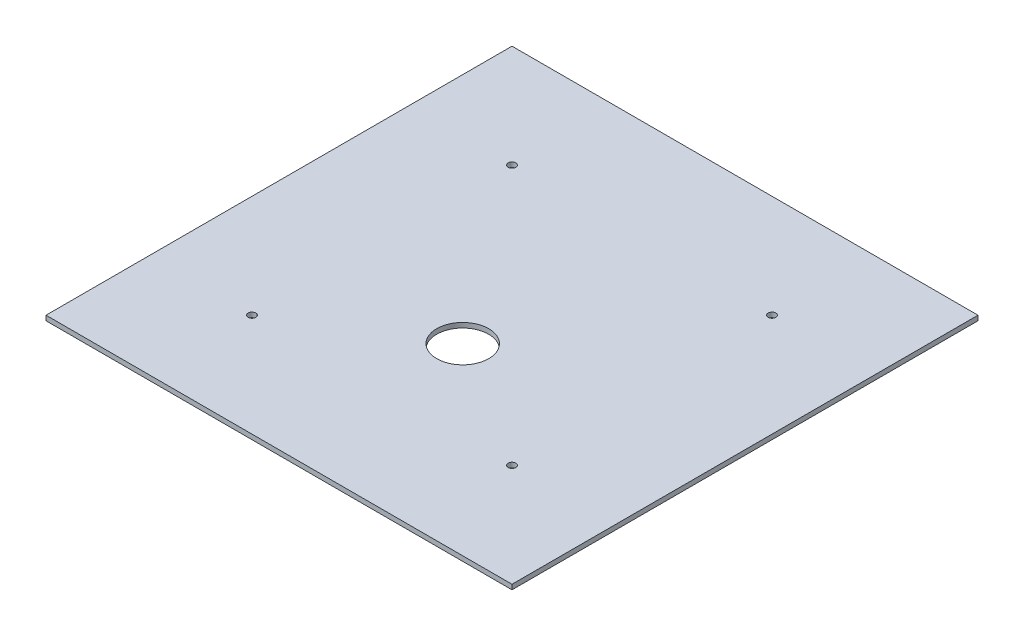
ISO-10303-21;
HEADER;
FILE_DESCRIPTION(('STEP AP214'),'2;1');
FILE_NAME('part.step','',(''),(''),'','','');
FILE_SCHEMA(('AUTOMOTIVE_DESIGN { 1 0 10303 214 1 1 1 1 }'));
ENDSEC;
DATA;
#1=APPLICATION_CONTEXT('core data for automotive mechanical design processes');
#2=APPLICATION_PROTOCOL_DEFINITION('international standard','automotive_design',2000,#1);
#3=PRODUCT_CONTEXT('',#1,'mechanical');
#4=PRODUCT('Part','Part','',(#3));
#5=PRODUCT_RELATED_PRODUCT_CATEGORY('part','',(#4));
#6=PRODUCT_DEFINITION_FORMATION('','',#4);
#7=PRODUCT_DEFINITION_CONTEXT('part definition',#1,'design');
#8=PRODUCT_DEFINITION('design','',#6,#7);
#9=PRODUCT_DEFINITION_SHAPE('','',#8);
#10=(LENGTH_UNIT() NAMED_UNIT(*) SI_UNIT(.MILLI.,.METRE.));
#11=(NAMED_UNIT(*) PLANE_ANGLE_UNIT() SI_UNIT($,.RADIAN.));
#12=(NAMED_UNIT(*) SI_UNIT($,.STERADIAN.) SOLID_ANGLE_UNIT());
#13=UNCERTAINTY_MEASURE_WITH_UNIT(LENGTH_MEASURE(1.E-05),#10,'distance_accuracy_value','');
#14=(GEOMETRIC_REPRESENTATION_CONTEXT(3) GLOBAL_UNCERTAINTY_ASSIGNED_CONTEXT((#13)) GLOBAL_UNIT_ASSIGNED_CONTEXT((#10,
#11,#12)) REPRESENTATION_CONTEXT('',''));
#15=CARTESIAN_POINT('',(0.,0.,0.));
#16=DIRECTION('',(0.,0.,1.));
#17=DIRECTION('',(1.,0.,0.));
#18=AXIS2_PLACEMENT_3D('',#15,#16,#17);
#19=CARTESIAN_POINT('',(152.4,3.175,152.4));
#20=DIRECTION('',(-1.,0.,0.));
#21=DIRECTION('',(0.,0.,1.));
#22=AXIS2_PLACEMENT_3D('',#19,#20,#21);
#23=PLANE('',#22);
#24=DIRECTION('',(0.,0.,-1.));
#25=VECTOR('',#24,1.);
#26=CARTESIAN_POINT('',(152.4,0.,152.4));
#27=LINE('',#26,#25);
#28=CARTESIAN_POINT('',(152.4,0.,152.4));
#29=VERTEX_POINT('',#28);
#30=CARTESIAN_POINT('',(152.4,0.,-152.4));
#31=VERTEX_POINT('',#30);
#32=EDGE_CURVE('E100',#29,#31,#27,.T.);
#33=ORIENTED_EDGE('',*,*,#32,.T.);
#34=DIRECTION('',(0.,-1.,0.));
#35=VECTOR('',#34,1.);
#36=CARTESIAN_POINT('',(152.4,3.175,-152.4));
#37=LINE('',#36,#35);
#38=CARTESIAN_POINT('',(152.4,3.175,-152.4));
#39=VERTEX_POINT('',#38);
#40=EDGE_CURVE('E11',#39,#31,#37,.T.);
#41=ORIENTED_EDGE('',*,*,#40,.F.);
#42=DIRECTION('',(0.,0.,-1.));
#43=VECTOR('',#42,1.);
#44=CARTESIAN_POINT('',(152.4,3.175,152.4));
#45=LINE('',#44,#43);
#46=CARTESIAN_POINT('',(152.4,3.175,152.4));
#47=VERTEX_POINT('',#46);
#48=EDGE_CURVE('E88',#47,#39,#45,.T.);
#49=ORIENTED_EDGE('',*,*,#48,.F.);
#50=DIRECTION('',(0.,-1.,0.));
#51=VECTOR('',#50,1.);
#52=CARTESIAN_POINT('',(152.4,3.175,152.4));
#53=LINE('',#52,#51);
#54=EDGE_CURVE('E96',#47,#29,#53,.T.);
#55=ORIENTED_EDGE('',*,*,#54,.T.);
#56=EDGE_LOOP('',(#33,#41,#49,#55));
#57=FACE_BOUND('',#56,.T.);
#58=ADVANCED_FACE('F37',(#57),#23,.F.);
#59=CARTESIAN_POINT('',(-152.4,3.175,-152.4));
#60=DIRECTION('',(0.,0.,1.));
#61=DIRECTION('',(1.,0.,0.));
#62=AXIS2_PLACEMENT_3D('',#59,#60,#61);
#63=PLANE('',#62);
#64=DIRECTION('',(-1.,0.,0.));
#65=VECTOR('',#64,1.);
#66=CARTESIAN_POINT('',(-152.4,0.,-152.4));
#67=LINE('',#66,#65);
#68=CARTESIAN_POINT('',(-152.4,0.,-152.4));
#69=VERTEX_POINT('',#68);
#70=EDGE_CURVE('E92',#31,#69,#67,.T.);
#71=ORIENTED_EDGE('',*,*,#70,.T.);
#72=DIRECTION('',(0.,-1.,0.));
#73=VECTOR('',#72,1.);
#74=CARTESIAN_POINT('',(-152.4,3.175,-152.4));
#75=LINE('',#74,#73);
#76=CARTESIAN_POINT('',(-152.4,3.175,-152.4));
#77=VERTEX_POINT('',#76);
#78=EDGE_CURVE('E45',#77,#69,#75,.T.);
#79=ORIENTED_EDGE('',*,*,#78,.F.);
#80=DIRECTION('',(-1.,0.,0.));
#81=VECTOR('',#80,1.);
#82=CARTESIAN_POINT('',(-152.4,3.175,-152.4));
#83=LINE('',#82,#81);
#84=EDGE_CURVE('E83',#39,#77,#83,.T.);
#85=ORIENTED_EDGE('',*,*,#84,.F.);
#86=ORIENTED_EDGE('',*,*,#40,.T.);
#87=EDGE_LOOP('',(#71,#79,#85,#86));
#88=FACE_BOUND('',#87,.T.);
#89=ADVANCED_FACE('F91',(#88),#63,.F.);
#90=CARTESIAN_POINT('',(-152.4,3.175,152.4));
#91=DIRECTION('',(1.,0.,0.));
#92=DIRECTION('',(0.,0.,-1.));
#93=AXIS2_PLACEMENT_3D('',#90,#91,#92);
#94=PLANE('',#93);
#95=DIRECTION('',(0.,0.,1.));
#96=VECTOR('',#95,1.);
#97=CARTESIAN_POINT('',(-152.4,0.,152.4));
#98=LINE('',#97,#96);
#99=CARTESIAN_POINT('',(-152.4,0.,152.4));
#100=VERTEX_POINT('',#99);
#101=EDGE_CURVE('E70',#69,#100,#98,.T.);
#102=ORIENTED_EDGE('',*,*,#101,.T.);
#103=DIRECTION('',(0.,-1.,0.));
#104=VECTOR('',#103,1.);
#105=CARTESIAN_POINT('',(-152.4,3.175,152.4));
#106=LINE('',#105,#104);
#107=CARTESIAN_POINT('',(-152.4,3.175,152.4));
#108=VERTEX_POINT('',#107);
#109=EDGE_CURVE('E93',#108,#100,#106,.T.);
#110=ORIENTED_EDGE('',*,*,#109,.F.);
#111=DIRECTION('',(0.,0.,1.));
#112=VECTOR('',#111,1.);
#113=CARTESIAN_POINT('',(-152.4,3.175,152.4));
#114=LINE('',#113,#112);
#115=EDGE_CURVE('E86',#77,#108,#114,.T.);
#116=ORIENTED_EDGE('',*,*,#115,.F.);
#117=ORIENTED_EDGE('',*,*,#78,.T.);
#118=EDGE_LOOP('',(#102,#110,#116,#117));
#119=FACE_BOUND('',#118,.T.);
#120=ADVANCED_FACE('F94',(#119),#94,.F.);
#121=CARTESIAN_POINT('',(-152.4,3.175,152.4));
#122=DIRECTION('',(0.,0.,-1.));
#123=DIRECTION('',(-1.,0.,0.));
#124=AXIS2_PLACEMENT_3D('',#121,#122,#123);
#125=PLANE('',#124);
#126=DIRECTION('',(1.,0.,0.));
#127=VECTOR('',#126,1.);
#128=CARTESIAN_POINT('',(-152.4,0.,152.4));
#129=LINE('',#128,#127);
#130=EDGE_CURVE('E76',#100,#29,#129,.T.);
#131=ORIENTED_EDGE('',*,*,#130,.T.);
#132=ORIENTED_EDGE('',*,*,#54,.F.);
#133=DIRECTION('',(1.,0.,0.));
#134=VECTOR('',#133,1.);
#135=CARTESIAN_POINT('',(-152.4,3.175,152.4));
#136=LINE('',#135,#134);
#137=EDGE_CURVE('E53',#108,#47,#136,.T.);
#138=ORIENTED_EDGE('',*,*,#137,.F.);
#139=ORIENTED_EDGE('',*,*,#109,.T.);
#140=EDGE_LOOP('',(#131,#132,#138,#139));
#141=FACE_BOUND('',#140,.T.);
#142=ADVANCED_FACE('F108',(#141),#125,.F.);
#143=CARTESIAN_POINT('',(0.,3.175,0.));
#144=DIRECTION('',(0.,-1.,0.));
#145=DIRECTION('',(0.,0.,-1.));
#146=AXIS2_PLACEMENT_3D('',#143,#144,#145);
#147=PLANE('',#146);
#148=CARTESIAN_POINT('',(0.,3.175,32.24));
#149=DIRECTION('',(0.,1.,0.));
#150=DIRECTION('',(0.,0.,1.));
#151=AXIS2_PLACEMENT_3D('',#148,#149,#150);
#152=CIRCLE('',#151,17.);
#153=CARTESIAN_POINT('',(0.,3.175,49.24));
#154=VERTEX_POINT('',#153);
#155=EDGE_CURVE('E138',#154,#154,#152,.T.);
#156=ORIENTED_EDGE('',*,*,#155,.F.);
#157=EDGE_LOOP('',(#156));
#158=FACE_BOUND('',#157,.T.);
#159=CARTESIAN_POINT('',(85.035,3.175,-85.035));
#160=DIRECTION('',(0.,1.,0.));
#161=DIRECTION('',(0.,0.,1.));
#162=AXIS2_PLACEMENT_3D('',#159,#160,#161);
#163=CIRCLE('',#162,2.5);
#164=CARTESIAN_POINT('',(85.035,3.175,-82.535));
#165=VERTEX_POINT('',#164);
#166=EDGE_CURVE('E117',#165,#165,#163,.T.);
#167=ORIENTED_EDGE('',*,*,#166,.F.);
#168=EDGE_LOOP('',(#167));
#169=FACE_BOUND('',#168,.T.);
#170=CARTESIAN_POINT('',(-85.035,3.175,85.035));
#171=DIRECTION('',(0.,1.,0.));
#172=DIRECTION('',(0.,0.,1.));
#173=AXIS2_PLACEMENT_3D('',#170,#171,#172);
#174=CIRCLE('',#173,2.5);
#175=CARTESIAN_POINT('',(-85.035,3.175,87.535));
#176=VERTEX_POINT('',#175);
#177=EDGE_CURVE('E123',#176,#176,#174,.T.);
#178=ORIENTED_EDGE('',*,*,#177,.F.);
#179=EDGE_LOOP('',(#178));
#180=FACE_BOUND('',#179,.T.);
#181=CARTESIAN_POINT('',(85.035,3.175,85.035));
#182=DIRECTION('',(0.,1.,0.));
#183=DIRECTION('',(0.,0.,1.));
#184=AXIS2_PLACEMENT_3D('',#181,#182,#183);
#185=CIRCLE('',#184,2.5);
#186=CARTESIAN_POINT('',(85.035,3.175,87.535));
#187=VERTEX_POINT('',#186);
#188=EDGE_CURVE('E124',#187,#187,#185,.T.);
#189=ORIENTED_EDGE('',*,*,#188,.F.);
#190=EDGE_LOOP('',(#189));
#191=FACE_BOUND('',#190,.T.);
#192=CARTESIAN_POINT('',(-85.035,3.175,-85.035));
#193=DIRECTION('',(0.,1.,0.));
#194=DIRECTION('',(0.,0.,1.));
#195=AXIS2_PLACEMENT_3D('',#192,#193,#194);
#196=CIRCLE('',#195,2.5);
#197=CARTESIAN_POINT('',(-85.035,3.175,-82.535));
#198=VERTEX_POINT('',#197);
#199=EDGE_CURVE('E114',#198,#198,#196,.T.);
#200=ORIENTED_EDGE('',*,*,#199,.F.);
#201=EDGE_LOOP('',(#200));
#202=FACE_BOUND('',#201,.T.);
#203=ORIENTED_EDGE('',*,*,#48,.T.);
#204=ORIENTED_EDGE('',*,*,#84,.T.);
#205=ORIENTED_EDGE('',*,*,#115,.T.);
#206=ORIENTED_EDGE('',*,*,#137,.T.);
#207=EDGE_LOOP('',(#203,#204,#205,#206));
#208=FACE_BOUND('',#207,.T.);
#209=ADVANCED_FACE('F84',(#158,#169,#180,#191,#202,#208),#147,.F.);
#210=CARTESIAN_POINT('',(0.,0.,0.));
#211=DIRECTION('',(0.,-1.,0.));
#212=DIRECTION('',(0.,0.,-1.));
#213=AXIS2_PLACEMENT_3D('',#210,#211,#212);
#214=PLANE('',#213);
#215=CARTESIAN_POINT('',(0.,0.,32.24));
#216=DIRECTION('',(0.,1.,0.));
#217=DIRECTION('',(0.,0.,1.));
#218=AXIS2_PLACEMENT_3D('',#215,#216,#217);
#219=CIRCLE('',#218,17.);
#220=CARTESIAN_POINT('',(0.,0.,49.24));
#221=VERTEX_POINT('',#220);
#222=EDGE_CURVE('E135',#221,#221,#219,.T.);
#223=ORIENTED_EDGE('',*,*,#222,.T.);
#224=EDGE_LOOP('',(#223));
#225=FACE_BOUND('',#224,.T.);
#226=CARTESIAN_POINT('',(85.035,0.,-85.035));
#227=DIRECTION('',(0.,1.,0.));
#228=DIRECTION('',(0.,0.,1.));
#229=AXIS2_PLACEMENT_3D('',#226,#227,#228);
#230=CIRCLE('',#229,2.5);
#231=CARTESIAN_POINT('',(85.035,0.,-82.535));
#232=VERTEX_POINT('',#231);
#233=EDGE_CURVE('E127',#232,#232,#230,.T.);
#234=ORIENTED_EDGE('',*,*,#233,.T.);
#235=EDGE_LOOP('',(#234));
#236=FACE_BOUND('',#235,.T.);
#237=CARTESIAN_POINT('',(-85.035,0.,85.035));
#238=DIRECTION('',(0.,1.,0.));
#239=DIRECTION('',(0.,0.,1.));
#240=AXIS2_PLACEMENT_3D('',#237,#238,#239);
#241=CIRCLE('',#240,2.5);
#242=CARTESIAN_POINT('',(-85.035,0.,87.535));
#243=VERTEX_POINT('',#242);
#244=EDGE_CURVE('E120',#243,#243,#241,.T.);
#245=ORIENTED_EDGE('',*,*,#244,.T.);
#246=EDGE_LOOP('',(#245));
#247=FACE_BOUND('',#246,.T.);
#248=CARTESIAN_POINT('',(85.035,0.,85.035));
#249=DIRECTION('',(0.,1.,0.));
#250=DIRECTION('',(0.,0.,1.));
#251=AXIS2_PLACEMENT_3D('',#248,#249,#250);
#252=CIRCLE('',#251,2.5);
#253=CARTESIAN_POINT('',(85.035,0.,87.535));
#254=VERTEX_POINT('',#253);
#255=EDGE_CURVE('E132',#254,#254,#252,.T.);
#256=ORIENTED_EDGE('',*,*,#255,.T.);
#257=EDGE_LOOP('',(#256));
#258=FACE_BOUND('',#257,.T.);
#259=CARTESIAN_POINT('',(-85.035,0.,-85.035));
#260=DIRECTION('',(0.,1.,0.));
#261=DIRECTION('',(0.,0.,1.));
#262=AXIS2_PLACEMENT_3D('',#259,#260,#261);
#263=CIRCLE('',#262,2.5);
#264=CARTESIAN_POINT('',(-85.035,0.,-82.535));
#265=VERTEX_POINT('',#264);
#266=EDGE_CURVE('E103',#265,#265,#263,.T.);
#267=ORIENTED_EDGE('',*,*,#266,.T.);
#268=EDGE_LOOP('',(#267));
#269=FACE_BOUND('',#268,.T.);
#270=ORIENTED_EDGE('',*,*,#32,.F.);
#271=ORIENTED_EDGE('',*,*,#130,.F.);
#272=ORIENTED_EDGE('',*,*,#101,.F.);
#273=ORIENTED_EDGE('',*,*,#70,.F.);
#274=EDGE_LOOP('',(#270,#271,#272,#273));
#275=FACE_BOUND('',#274,.T.);
#276=ADVANCED_FACE('F111',(#225,#236,#247,#258,#269,#275),#214,.T.);
#277=CARTESIAN_POINT('',(-85.035,0.,-85.035));
#278=DIRECTION('',(0.,1.,0.));
#279=DIRECTION('',(0.,0.,1.));
#280=AXIS2_PLACEMENT_3D('',#277,#278,#279);
#281=CYLINDRICAL_SURFACE('',#280,2.5);
#282=ORIENTED_EDGE('',*,*,#266,.F.);
#283=EDGE_LOOP('',(#282));
#284=FACE_BOUND('',#283,.T.);
#285=ORIENTED_EDGE('',*,*,#199,.T.);
#286=EDGE_LOOP('',(#285));
#287=FACE_BOUND('',#286,.T.);
#288=ADVANCED_FACE('F164',(#284,#287),#281,.F.);
#289=CARTESIAN_POINT('',(85.035,0.,85.035));
#290=DIRECTION('',(0.,1.,0.));
#291=DIRECTION('',(0.,0.,1.));
#292=AXIS2_PLACEMENT_3D('',#289,#290,#291);
#293=CYLINDRICAL_SURFACE('',#292,2.5);
#294=ORIENTED_EDGE('',*,*,#255,.F.);
#295=EDGE_LOOP('',(#294));
#296=FACE_BOUND('',#295,.T.);
#297=ORIENTED_EDGE('',*,*,#188,.T.);
#298=EDGE_LOOP('',(#297));
#299=FACE_BOUND('',#298,.T.);
#300=ADVANCED_FACE('F166',(#296,#299),#293,.F.);
#301=CARTESIAN_POINT('',(-85.035,0.,85.035));
#302=DIRECTION('',(0.,1.,0.));
#303=DIRECTION('',(0.,0.,1.));
#304=AXIS2_PLACEMENT_3D('',#301,#302,#303);
#305=CYLINDRICAL_SURFACE('',#304,2.5);
#306=ORIENTED_EDGE('',*,*,#244,.F.);
#307=EDGE_LOOP('',(#306));
#308=FACE_BOUND('',#307,.T.);
#309=ORIENTED_EDGE('',*,*,#177,.T.);
#310=EDGE_LOOP('',(#309));
#311=FACE_BOUND('',#310,.T.);
#312=ADVANCED_FACE('F173',(#308,#311),#305,.F.);
#313=CARTESIAN_POINT('',(85.035,0.,-85.035));
#314=DIRECTION('',(0.,1.,0.));
#315=DIRECTION('',(0.,0.,1.));
#316=AXIS2_PLACEMENT_3D('',#313,#314,#315);
#317=CYLINDRICAL_SURFACE('',#316,2.5);
#318=ORIENTED_EDGE('',*,*,#233,.F.);
#319=EDGE_LOOP('',(#318));
#320=FACE_BOUND('',#319,.T.);
#321=ORIENTED_EDGE('',*,*,#166,.T.);
#322=EDGE_LOOP('',(#321));
#323=FACE_BOUND('',#322,.T.);
#324=ADVANCED_FACE('F149',(#320,#323),#317,.F.);
#325=CARTESIAN_POINT('',(0.,0.,32.24));
#326=DIRECTION('',(0.,1.,0.));
#327=DIRECTION('',(0.,0.,1.));
#328=AXIS2_PLACEMENT_3D('',#325,#326,#327);
#329=CYLINDRICAL_SURFACE('',#328,17.);
#330=ORIENTED_EDGE('',*,*,#222,.F.);
#331=EDGE_LOOP('',(#330));
#332=FACE_BOUND('',#331,.T.);
#333=ORIENTED_EDGE('',*,*,#155,.T.);
#334=EDGE_LOOP('',(#333));
#335=FACE_BOUND('',#334,.T.);
#336=ADVANCED_FACE('F146',(#332,#335),#329,.F.);
#337=CLOSED_SHELL('',(#58,#89,#120,#142,#209,#276,#288,#300,#312,#324,#336));
#338=MANIFOLD_SOLID_BREP('B2',#337);
#339=ADVANCED_BREP_SHAPE_REPRESENTATION('',(#18,#338),#14);
#340=SHAPE_DEFINITION_REPRESENTATION(#9,#339);
ENDSEC;
END-ISO-10303-21;
